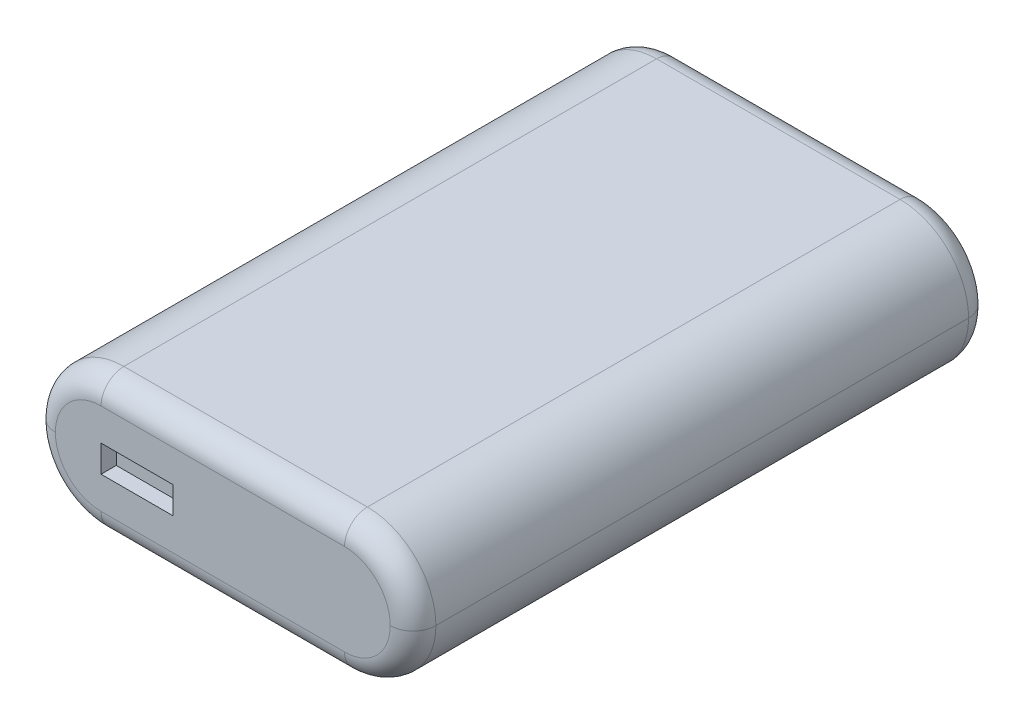
ISO-10303-21;
HEADER;
FILE_DESCRIPTION(('STEP AP214'),'2;1');
FILE_NAME('part.step','',(''),(''),'','','');
FILE_SCHEMA(('AUTOMOTIVE_DESIGN { 1 0 10303 214 1 1 1 1 }'));
ENDSEC;
DATA;
#1=APPLICATION_CONTEXT('core data for automotive mechanical design processes');
#2=APPLICATION_PROTOCOL_DEFINITION('international standard','automotive_design',2000,#1);
#3=PRODUCT_CONTEXT('',#1,'mechanical');
#4=PRODUCT('Part','Part','',(#3));
#5=PRODUCT_RELATED_PRODUCT_CATEGORY('part','',(#4));
#6=PRODUCT_DEFINITION_FORMATION('','',#4);
#7=PRODUCT_DEFINITION_CONTEXT('part definition',#1,'design');
#8=PRODUCT_DEFINITION('design','',#6,#7);
#9=PRODUCT_DEFINITION_SHAPE('','',#8);
#10=(LENGTH_UNIT() NAMED_UNIT(*) SI_UNIT(.MILLI.,.METRE.));
#11=(NAMED_UNIT(*) PLANE_ANGLE_UNIT() SI_UNIT($,.RADIAN.));
#12=(NAMED_UNIT(*) SI_UNIT($,.STERADIAN.) SOLID_ANGLE_UNIT());
#13=UNCERTAINTY_MEASURE_WITH_UNIT(LENGTH_MEASURE(1.E-05),#10,'distance_accuracy_value','');
#14=(GEOMETRIC_REPRESENTATION_CONTEXT(3) GLOBAL_UNCERTAINTY_ASSIGNED_CONTEXT((#13)) GLOBAL_UNIT_ASSIGNED_CONTEXT((#10,
#11,#12)) REPRESENTATION_CONTEXT('',''));
#15=CARTESIAN_POINT('',(0.,0.,0.));
#16=DIRECTION('',(0.,0.,1.));
#17=DIRECTION('',(1.,0.,0.));
#18=AXIS2_PLACEMENT_3D('',#15,#16,#17);
#19=CARTESIAN_POINT('',(-31.75,11.43,-48.26));
#20=DIRECTION('',(0.,0.,1.));
#21=DIRECTION('',(1.,0.,0.));
#22=AXIS2_PLACEMENT_3D('',#19,#20,#21);
#23=PLANE('',#22);
#24=DIRECTION('',(-1.,0.,0.));
#25=VECTOR('',#24,1.);
#26=CARTESIAN_POINT('',(20.32,7.62,-48.26));
#27=LINE('',#26,#25);
#28=CARTESIAN_POINT('',(-20.32,7.62,-48.26));
#29=VERTEX_POINT('',#28);
#30=CARTESIAN_POINT('',(20.32,7.62,-48.26));
#31=VERTEX_POINT('',#30);
#32=EDGE_CURVE('E244',#29,#31,#27,.F.);
#33=ORIENTED_EDGE('',*,*,#32,.T.);
#34=CARTESIAN_POINT('',(20.32,0.,-48.26));
#35=DIRECTION('',(0.,0.,1.));
#36=DIRECTION('',(1.,0.,0.));
#37=AXIS2_PLACEMENT_3D('',#34,#35,#36);
#38=CIRCLE('',#37,7.62);
#39=CARTESIAN_POINT('',(27.94,0.,-48.26));
#40=VERTEX_POINT('',#39);
#41=EDGE_CURVE('E254',#31,#40,#38,.F.);
#42=ORIENTED_EDGE('',*,*,#41,.T.);
#43=CARTESIAN_POINT('',(20.32,0.,-48.26));
#44=DIRECTION('',(0.,0.,1.));
#45=DIRECTION('',(1.,0.,0.));
#46=AXIS2_PLACEMENT_3D('',#43,#44,#45);
#47=CIRCLE('',#46,7.62);
#48=CARTESIAN_POINT('',(20.32,-7.62,-48.26));
#49=VERTEX_POINT('',#48);
#50=EDGE_CURVE('E252',#40,#49,#47,.F.);
#51=ORIENTED_EDGE('',*,*,#50,.T.);
#52=DIRECTION('',(-1.,0.,0.));
#53=VECTOR('',#52,1.);
#54=CARTESIAN_POINT('',(-31.75,-7.62,-48.26));
#55=LINE('',#54,#53);
#56=CARTESIAN_POINT('',(-20.32,-7.62,-48.26));
#57=VERTEX_POINT('',#56);
#58=EDGE_CURVE('E250',#49,#57,#55,.T.);
#59=ORIENTED_EDGE('',*,*,#58,.T.);
#60=CARTESIAN_POINT('',(-20.32,0.,-48.26));
#61=DIRECTION('',(0.,0.,1.));
#62=DIRECTION('',(1.,0.,0.));
#63=AXIS2_PLACEMENT_3D('',#60,#61,#62);
#64=CIRCLE('',#63,7.62);
#65=CARTESIAN_POINT('',(-27.94,0.,-48.26));
#66=VERTEX_POINT('',#65);
#67=EDGE_CURVE('E248',#57,#66,#64,.F.);
#68=ORIENTED_EDGE('',*,*,#67,.T.);
#69=CARTESIAN_POINT('',(-20.32,0.,-48.26));
#70=DIRECTION('',(0.,0.,1.));
#71=DIRECTION('',(1.,0.,0.));
#72=AXIS2_PLACEMENT_3D('',#69,#70,#71);
#73=CIRCLE('',#72,7.62);
#74=EDGE_CURVE('E246',#66,#29,#73,.F.);
#75=ORIENTED_EDGE('',*,*,#74,.T.);
#76=EDGE_LOOP('',(#33,#42,#51,#59,#68,#75));
#77=FACE_BOUND('',#76,.T.);
#78=ADVANCED_FACE('F36',(#77),#23,.F.);
#79=CARTESIAN_POINT('',(-31.75,11.43,48.26));
#80=DIRECTION('',(0.,0.,-1.));
#81=DIRECTION('',(-1.,0.,0.));
#82=AXIS2_PLACEMENT_3D('',#79,#80,#81);
#83=PLANE('',#82);
#84=DIRECTION('',(-1.,0.,0.));
#85=VECTOR('',#84,1.);
#86=CARTESIAN_POINT('',(-20.32,2.249999945,48.26));
#87=LINE('',#86,#85);
#88=CARTESIAN_POINT('',(-8.32,2.249999945,48.26));
#89=VERTEX_POINT('',#88);
#90=CARTESIAN_POINT('',(-20.32,2.249999945,48.26));
#91=VERTEX_POINT('',#90);
#92=EDGE_CURVE('E181',#89,#91,#87,.T.);
#93=ORIENTED_EDGE('',*,*,#92,.F.);
#94=DIRECTION('',(0.,1.,0.));
#95=VECTOR('',#94,1.);
#96=CARTESIAN_POINT('',(-8.32,2.249999945,48.26));
#97=LINE('',#96,#95);
#98=CARTESIAN_POINT('',(-8.32,-2.249999945,48.26));
#99=VERTEX_POINT('',#98);
#100=EDGE_CURVE('E53',#99,#89,#97,.T.);
#101=ORIENTED_EDGE('',*,*,#100,.F.);
#102=DIRECTION('',(1.,0.,0.));
#103=VECTOR('',#102,1.);
#104=CARTESIAN_POINT('',(-20.32,-2.249999945,48.26));
#105=LINE('',#104,#103);
#106=CARTESIAN_POINT('',(-20.32,-2.249999945,48.26));
#107=VERTEX_POINT('',#106);
#108=EDGE_CURVE('E172',#107,#99,#105,.T.);
#109=ORIENTED_EDGE('',*,*,#108,.F.);
#110=DIRECTION('',(0.,-1.,0.));
#111=VECTOR('',#110,1.);
#112=CARTESIAN_POINT('',(-20.32,2.249999945,48.26));
#113=LINE('',#112,#111);
#114=EDGE_CURVE('E175',#91,#107,#113,.T.);
#115=ORIENTED_EDGE('',*,*,#114,.F.);
#116=EDGE_LOOP('',(#93,#101,#109,#115));
#117=FACE_BOUND('',#116,.T.);
#118=DIRECTION('',(1.,0.,0.));
#119=VECTOR('',#118,1.);
#120=CARTESIAN_POINT('',(-20.32,7.62,48.26));
#121=LINE('',#120,#119);
#122=CARTESIAN_POINT('',(20.32,7.62,48.26));
#123=VERTEX_POINT('',#122);
#124=CARTESIAN_POINT('',(-20.32,7.62,48.26));
#125=VERTEX_POINT('',#124);
#126=EDGE_CURVE('E203',#123,#125,#121,.F.);
#127=ORIENTED_EDGE('',*,*,#126,.T.);
#128=CARTESIAN_POINT('',(-20.32,0.,48.26));
#129=DIRECTION('',(0.,0.,-1.));
#130=DIRECTION('',(-1.,0.,0.));
#131=AXIS2_PLACEMENT_3D('',#128,#129,#130);
#132=CIRCLE('',#131,7.62);
#133=CARTESIAN_POINT('',(-27.94,0.,48.26));
#134=VERTEX_POINT('',#133);
#135=EDGE_CURVE('E219',#125,#134,#132,.F.);
#136=ORIENTED_EDGE('',*,*,#135,.T.);
#137=CARTESIAN_POINT('',(-20.32,0.,48.26));
#138=DIRECTION('',(0.,0.,-1.));
#139=DIRECTION('',(-1.,0.,0.));
#140=AXIS2_PLACEMENT_3D('',#137,#138,#139);
#141=CIRCLE('',#140,7.62);
#142=CARTESIAN_POINT('',(-20.32,-7.62,48.26));
#143=VERTEX_POINT('',#142);
#144=EDGE_CURVE('E217',#134,#143,#141,.F.);
#145=ORIENTED_EDGE('',*,*,#144,.T.);
#146=DIRECTION('',(1.,0.,0.));
#147=VECTOR('',#146,1.);
#148=CARTESIAN_POINT('',(-31.75,-7.62,48.26));
#149=LINE('',#148,#147);
#150=CARTESIAN_POINT('',(20.32,-7.62,48.26));
#151=VERTEX_POINT('',#150);
#152=EDGE_CURVE('E215',#143,#151,#149,.T.);
#153=ORIENTED_EDGE('',*,*,#152,.T.);
#154=CARTESIAN_POINT('',(20.32,0.,48.26));
#155=DIRECTION('',(0.,0.,-1.));
#156=DIRECTION('',(-1.,0.,0.));
#157=AXIS2_PLACEMENT_3D('',#154,#155,#156);
#158=CIRCLE('',#157,7.62);
#159=CARTESIAN_POINT('',(27.94,0.,48.26));
#160=VERTEX_POINT('',#159);
#161=EDGE_CURVE('E213',#151,#160,#158,.F.);
#162=ORIENTED_EDGE('',*,*,#161,.T.);
#163=CARTESIAN_POINT('',(20.32,0.,48.26));
#164=DIRECTION('',(0.,0.,-1.));
#165=DIRECTION('',(-1.,0.,0.));
#166=AXIS2_PLACEMENT_3D('',#163,#164,#165);
#167=CIRCLE('',#166,7.62);
#168=EDGE_CURVE('E211',#160,#123,#167,.F.);
#169=ORIENTED_EDGE('',*,*,#168,.T.);
#170=EDGE_LOOP('',(#127,#136,#145,#153,#162,#169));
#171=FACE_BOUND('',#170,.T.);
#172=ADVANCED_FACE('F366',(#117,#171),#83,.F.);
#173=CARTESIAN_POINT('',(0.,11.43,0.));
#174=DIRECTION('',(0.,1.,0.));
#175=DIRECTION('',(0.,0.,1.));
#176=AXIS2_PLACEMENT_3D('',#173,#174,#175);
#177=PLANE('',#176);
#178=DIRECTION('',(0.,0.,1.));
#179=VECTOR('',#178,1.);
#180=CARTESIAN_POINT('',(-20.32,11.43,48.26));
#181=LINE('',#180,#179);
#182=CARTESIAN_POINT('',(-20.32,11.43,-44.45));
#183=VERTEX_POINT('',#182);
#184=CARTESIAN_POINT('',(-20.32,11.43,44.45));
#185=VERTEX_POINT('',#184);
#186=EDGE_CURVE('E200',#183,#185,#181,.T.);
#187=ORIENTED_EDGE('',*,*,#186,.T.);
#188=DIRECTION('',(1.,0.,0.));
#189=VECTOR('',#188,1.);
#190=CARTESIAN_POINT('',(20.32,11.43,44.45));
#191=LINE('',#190,#189);
#192=CARTESIAN_POINT('',(20.32,11.43,44.45));
#193=VERTEX_POINT('',#192);
#194=EDGE_CURVE('E11',#185,#193,#191,.T.);
#195=ORIENTED_EDGE('',*,*,#194,.T.);
#196=DIRECTION('',(0.,0.,-1.));
#197=VECTOR('',#196,1.);
#198=CARTESIAN_POINT('',(20.32,11.43,-48.26));
#199=LINE('',#198,#197);
#200=CARTESIAN_POINT('',(20.32,11.43,-44.45));
#201=VERTEX_POINT('',#200);
#202=EDGE_CURVE('E197',#193,#201,#199,.T.);
#203=ORIENTED_EDGE('',*,*,#202,.T.);
#204=DIRECTION('',(-1.,0.,0.));
#205=VECTOR('',#204,1.);
#206=CARTESIAN_POINT('',(-20.32,11.43,-44.45));
#207=LINE('',#206,#205);
#208=EDGE_CURVE('E45',#201,#183,#207,.T.);
#209=ORIENTED_EDGE('',*,*,#208,.T.);
#210=EDGE_LOOP('',(#187,#195,#203,#209));
#211=FACE_BOUND('',#210,.T.);
#212=ADVANCED_FACE('F330',(#211),#177,.T.);
#213=CARTESIAN_POINT('',(0.,-11.43,0.));
#214=DIRECTION('',(0.,1.,0.));
#215=DIRECTION('',(0.,0.,1.));
#216=AXIS2_PLACEMENT_3D('',#213,#214,#215);
#217=PLANE('',#216);
#218=DIRECTION('',(0.,0.,-1.));
#219=VECTOR('',#218,1.);
#220=CARTESIAN_POINT('',(20.32,-11.43,0.));
#221=LINE('',#220,#219);
#222=CARTESIAN_POINT('',(20.32,-11.43,-44.45));
#223=VERTEX_POINT('',#222);
#224=CARTESIAN_POINT('',(20.32,-11.43,44.45));
#225=VERTEX_POINT('',#224);
#226=EDGE_CURVE('E190',#223,#225,#221,.F.);
#227=ORIENTED_EDGE('',*,*,#226,.T.);
#228=DIRECTION('',(1.,0.,0.));
#229=VECTOR('',#228,1.);
#230=CARTESIAN_POINT('',(0.,-11.43,44.45));
#231=LINE('',#230,#229);
#232=CARTESIAN_POINT('',(-20.32,-11.43,44.45));
#233=VERTEX_POINT('',#232);
#234=EDGE_CURVE('E233',#225,#233,#231,.F.);
#235=ORIENTED_EDGE('',*,*,#234,.T.);
#236=DIRECTION('',(0.,0.,1.));
#237=VECTOR('',#236,1.);
#238=CARTESIAN_POINT('',(-20.32,-11.43,0.));
#239=LINE('',#238,#237);
#240=CARTESIAN_POINT('',(-20.32,-11.43,-44.45));
#241=VERTEX_POINT('',#240);
#242=EDGE_CURVE('E193',#233,#241,#239,.F.);
#243=ORIENTED_EDGE('',*,*,#242,.T.);
#244=DIRECTION('',(-1.,0.,0.));
#245=VECTOR('',#244,1.);
#246=CARTESIAN_POINT('',(0.,-11.43,-44.45));
#247=LINE('',#246,#245);
#248=EDGE_CURVE('E231',#241,#223,#247,.F.);
#249=ORIENTED_EDGE('',*,*,#248,.T.);
#250=EDGE_LOOP('',(#227,#235,#243,#249));
#251=FACE_BOUND('',#250,.T.);
#252=ADVANCED_FACE('F303',(#251),#217,.F.);
#253=CARTESIAN_POINT('',(-20.32,0.,0.));
#254=DIRECTION('',(0.,0.,-1.));
#255=DIRECTION('',(-1.,0.,0.));
#256=AXIS2_PLACEMENT_3D('',#253,#254,#255);
#257=CYLINDRICAL_SURFACE('',#256,11.43);
#258=DIRECTION('',(0.,0.,1.));
#259=VECTOR('',#258,1.);
#260=CARTESIAN_POINT('',(-31.75,0.,-48.26));
#261=LINE('',#260,#259);
#262=CARTESIAN_POINT('',(-31.75,0.,44.45));
#263=VERTEX_POINT('',#262);
#264=CARTESIAN_POINT('',(-31.75,0.,-44.45));
#265=VERTEX_POINT('',#264);
#266=EDGE_CURVE('E194',#263,#265,#261,.F.);
#267=ORIENTED_EDGE('',*,*,#266,.F.);
#268=CARTESIAN_POINT('',(-20.32,0.,44.45));
#269=DIRECTION('',(0.,0.,-1.));
#270=DIRECTION('',(-1.,0.,0.));
#271=AXIS2_PLACEMENT_3D('',#268,#269,#270);
#272=CIRCLE('',#271,11.43);
#273=EDGE_CURVE('E224',#263,#185,#272,.T.);
#274=ORIENTED_EDGE('',*,*,#273,.T.);
#275=ORIENTED_EDGE('',*,*,#186,.F.);
#276=CARTESIAN_POINT('',(-20.32,0.,-44.45));
#277=DIRECTION('',(0.,0.,1.));
#278=DIRECTION('',(1.,0.,0.));
#279=AXIS2_PLACEMENT_3D('',#276,#277,#278);
#280=CIRCLE('',#279,11.43);
#281=EDGE_CURVE('E222',#183,#265,#280,.T.);
#282=ORIENTED_EDGE('',*,*,#281,.T.);
#283=EDGE_LOOP('',(#267,#274,#275,#282));
#284=FACE_BOUND('',#283,.T.);
#285=ADVANCED_FACE('F317',(#284),#257,.T.);
#286=CARTESIAN_POINT('',(-20.32,0.,-48.26));
#287=DIRECTION('',(0.,0.,1.));
#288=DIRECTION('',(1.,0.,0.));
#289=AXIS2_PLACEMENT_3D('',#286,#287,#288);
#290=CYLINDRICAL_SURFACE('',#289,11.43);
#291=ORIENTED_EDGE('',*,*,#242,.F.);
#292=CARTESIAN_POINT('',(-20.32,0.,44.45));
#293=DIRECTION('',(0.,0.,-1.));
#294=DIRECTION('',(-1.,0.,0.));
#295=AXIS2_PLACEMENT_3D('',#292,#293,#294);
#296=CIRCLE('',#295,11.43);
#297=EDGE_CURVE('E229',#233,#263,#296,.T.);
#298=ORIENTED_EDGE('',*,*,#297,.T.);
#299=ORIENTED_EDGE('',*,*,#266,.T.);
#300=CARTESIAN_POINT('',(-20.32,0.,-44.45));
#301=DIRECTION('',(0.,0.,1.));
#302=DIRECTION('',(1.,0.,0.));
#303=AXIS2_PLACEMENT_3D('',#300,#301,#302);
#304=CIRCLE('',#303,11.43);
#305=EDGE_CURVE('E227',#265,#241,#304,.T.);
#306=ORIENTED_EDGE('',*,*,#305,.T.);
#307=EDGE_LOOP('',(#291,#298,#299,#306));
#308=FACE_BOUND('',#307,.T.);
#309=ADVANCED_FACE('F299',(#308),#290,.T.);
#310=CARTESIAN_POINT('',(20.32,0.,0.));
#311=DIRECTION('',(0.,0.,1.));
#312=DIRECTION('',(1.,0.,0.));
#313=AXIS2_PLACEMENT_3D('',#310,#311,#312);
#314=CYLINDRICAL_SURFACE('',#313,11.43);
#315=ORIENTED_EDGE('',*,*,#202,.F.);
#316=CARTESIAN_POINT('',(20.32,0.,44.45));
#317=DIRECTION('',(0.,0.,-1.));
#318=DIRECTION('',(-1.,0.,0.));
#319=AXIS2_PLACEMENT_3D('',#316,#317,#318);
#320=CIRCLE('',#319,11.43);
#321=CARTESIAN_POINT('',(31.75,0.,44.45));
#322=VERTEX_POINT('',#321);
#323=EDGE_CURVE('E242',#193,#322,#320,.T.);
#324=ORIENTED_EDGE('',*,*,#323,.T.);
#325=DIRECTION('',(0.,0.,-1.));
#326=VECTOR('',#325,1.);
#327=CARTESIAN_POINT('',(31.75,0.,48.26));
#328=LINE('',#327,#326);
#329=CARTESIAN_POINT('',(31.75,0.,-44.45));
#330=VERTEX_POINT('',#329);
#331=EDGE_CURVE('E206',#330,#322,#328,.F.);
#332=ORIENTED_EDGE('',*,*,#331,.F.);
#333=CARTESIAN_POINT('',(20.32,0.,-44.45));
#334=DIRECTION('',(0.,0.,1.));
#335=DIRECTION('',(1.,0.,0.));
#336=AXIS2_PLACEMENT_3D('',#333,#334,#335);
#337=CIRCLE('',#336,11.43);
#338=EDGE_CURVE('E239',#330,#201,#337,.T.);
#339=ORIENTED_EDGE('',*,*,#338,.T.);
#340=EDGE_LOOP('',(#315,#324,#332,#339));
#341=FACE_BOUND('',#340,.T.);
#342=ADVANCED_FACE('F333',(#341),#314,.T.);
#343=CARTESIAN_POINT('',(20.32,0.,-48.26));
#344=DIRECTION('',(0.,0.,-1.));
#345=DIRECTION('',(-1.,0.,0.));
#346=AXIS2_PLACEMENT_3D('',#343,#344,#345);
#347=CYLINDRICAL_SURFACE('',#346,11.43);
#348=ORIENTED_EDGE('',*,*,#331,.T.);
#349=CARTESIAN_POINT('',(20.32,0.,44.45));
#350=DIRECTION('',(0.,0.,-1.));
#351=DIRECTION('',(-1.,0.,0.));
#352=AXIS2_PLACEMENT_3D('',#349,#350,#351);
#353=CIRCLE('',#352,11.43);
#354=EDGE_CURVE('E237',#322,#225,#353,.T.);
#355=ORIENTED_EDGE('',*,*,#354,.T.);
#356=ORIENTED_EDGE('',*,*,#226,.F.);
#357=CARTESIAN_POINT('',(20.32,0.,-44.45));
#358=DIRECTION('',(0.,0.,1.));
#359=DIRECTION('',(1.,0.,0.));
#360=AXIS2_PLACEMENT_3D('',#357,#358,#359);
#361=CIRCLE('',#360,11.43);
#362=EDGE_CURVE('E235',#223,#330,#361,.T.);
#363=ORIENTED_EDGE('',*,*,#362,.T.);
#364=EDGE_LOOP('',(#348,#355,#356,#363));
#365=FACE_BOUND('',#364,.T.);
#366=ADVANCED_FACE('F344',(#365),#347,.T.);
#367=CARTESIAN_POINT('',(20.32,0.,44.45));
#368=DIRECTION('',(0.,0.,-1.));
#369=DIRECTION('',(-1.,0.,0.));
#370=AXIS2_PLACEMENT_3D('',#367,#368,#369);
#371=TOROIDAL_SURFACE('',#370,7.62,3.81);
#372=CARTESIAN_POINT('',(20.32,-7.62,44.45));
#373=DIRECTION('',(-1.,0.,0.));
#374=DIRECTION('',(0.,0.,1.));
#375=AXIS2_PLACEMENT_3D('',#372,#373,#374);
#376=CIRCLE('',#375,3.81);
#377=EDGE_CURVE('E268',#225,#151,#376,.T.);
#378=ORIENTED_EDGE('',*,*,#377,.F.);
#379=ORIENTED_EDGE('',*,*,#354,.F.);
#380=CARTESIAN_POINT('',(27.94,0.,44.45));
#381=DIRECTION('',(0.,1.,0.));
#382=DIRECTION('',(0.,0.,1.));
#383=AXIS2_PLACEMENT_3D('',#380,#381,#382);
#384=CIRCLE('',#383,3.81);
#385=EDGE_CURVE('E209',#160,#322,#384,.T.);
#386=ORIENTED_EDGE('',*,*,#385,.F.);
#387=ORIENTED_EDGE('',*,*,#161,.F.);
#388=EDGE_LOOP('',(#378,#379,#386,#387));
#389=FACE_BOUND('',#388,.T.);
#390=ADVANCED_FACE('F342',(#389),#371,.T.);
#391=CARTESIAN_POINT('',(20.32,0.,44.45));
#392=DIRECTION('',(0.,0.,-1.));
#393=DIRECTION('',(-1.,0.,0.));
#394=AXIS2_PLACEMENT_3D('',#391,#392,#393);
#395=TOROIDAL_SURFACE('',#394,7.62,3.81);
#396=ORIENTED_EDGE('',*,*,#385,.T.);
#397=ORIENTED_EDGE('',*,*,#323,.F.);
#398=CARTESIAN_POINT('',(20.32,7.62,44.45));
#399=DIRECTION('',(-1.,0.,0.));
#400=DIRECTION('',(0.,0.,1.));
#401=AXIS2_PLACEMENT_3D('',#398,#399,#400);
#402=CIRCLE('',#401,3.81);
#403=EDGE_CURVE('E265',#123,#193,#402,.T.);
#404=ORIENTED_EDGE('',*,*,#403,.F.);
#405=ORIENTED_EDGE('',*,*,#168,.F.);
#406=EDGE_LOOP('',(#396,#397,#404,#405));
#407=FACE_BOUND('',#406,.T.);
#408=ADVANCED_FACE('F336',(#407),#395,.T.);
#409=CARTESIAN_POINT('',(-31.75,-7.62,44.45));
#410=DIRECTION('',(1.,0.,0.));
#411=DIRECTION('',(0.,0.,-1.));
#412=AXIS2_PLACEMENT_3D('',#409,#410,#411);
#413=CYLINDRICAL_SURFACE('',#412,3.81);
#414=ORIENTED_EDGE('',*,*,#377,.T.);
#415=ORIENTED_EDGE('',*,*,#152,.F.);
#416=CARTESIAN_POINT('',(-20.32,-7.62,44.45));
#417=DIRECTION('',(-1.,0.,0.));
#418=DIRECTION('',(0.,0.,1.));
#419=AXIS2_PLACEMENT_3D('',#416,#417,#418);
#420=CIRCLE('',#419,3.81);
#421=EDGE_CURVE('E262',#233,#143,#420,.T.);
#422=ORIENTED_EDGE('',*,*,#421,.F.);
#423=ORIENTED_EDGE('',*,*,#234,.F.);
#424=EDGE_LOOP('',(#414,#415,#422,#423));
#425=FACE_BOUND('',#424,.T.);
#426=ADVANCED_FACE('F308',(#425),#413,.T.);
#427=CARTESIAN_POINT('',(0.,7.62,44.45));
#428=DIRECTION('',(-1.,0.,0.));
#429=DIRECTION('',(0.,0.,1.));
#430=AXIS2_PLACEMENT_3D('',#427,#428,#429);
#431=CYLINDRICAL_SURFACE('',#430,3.81);
#432=ORIENTED_EDGE('',*,*,#403,.T.);
#433=ORIENTED_EDGE('',*,*,#194,.F.);
#434=CARTESIAN_POINT('',(-20.32,7.62,44.45));
#435=DIRECTION('',(-1.,0.,0.));
#436=DIRECTION('',(0.,0.,1.));
#437=AXIS2_PLACEMENT_3D('',#434,#435,#436);
#438=CIRCLE('',#437,3.81);
#439=EDGE_CURVE('E260',#125,#185,#438,.T.);
#440=ORIENTED_EDGE('',*,*,#439,.F.);
#441=ORIENTED_EDGE('',*,*,#126,.F.);
#442=EDGE_LOOP('',(#432,#433,#440,#441));
#443=FACE_BOUND('',#442,.T.);
#444=ADVANCED_FACE('F326',(#443),#431,.T.);
#445=CARTESIAN_POINT('',(-20.32,0.,44.45));
#446=DIRECTION('',(0.,0.,-1.));
#447=DIRECTION('',(-1.,0.,0.));
#448=AXIS2_PLACEMENT_3D('',#445,#446,#447);
#449=TOROIDAL_SURFACE('',#448,7.62,3.81);
#450=ORIENTED_EDGE('',*,*,#421,.T.);
#451=ORIENTED_EDGE('',*,*,#144,.F.);
#452=CARTESIAN_POINT('',(-27.94,0.,44.45));
#453=DIRECTION('',(0.,1.,0.));
#454=DIRECTION('',(0.,0.,1.));
#455=AXIS2_PLACEMENT_3D('',#452,#453,#454);
#456=CIRCLE('',#455,3.81);
#457=EDGE_CURVE('E258',#263,#134,#456,.T.);
#458=ORIENTED_EDGE('',*,*,#457,.F.);
#459=ORIENTED_EDGE('',*,*,#297,.F.);
#460=EDGE_LOOP('',(#450,#451,#458,#459));
#461=FACE_BOUND('',#460,.T.);
#462=ADVANCED_FACE('F314',(#461),#449,.T.);
#463=CARTESIAN_POINT('',(-20.32,0.,44.45));
#464=DIRECTION('',(0.,0.,-1.));
#465=DIRECTION('',(-1.,0.,0.));
#466=AXIS2_PLACEMENT_3D('',#463,#464,#465);
#467=TOROIDAL_SURFACE('',#466,7.62,3.81);
#468=ORIENTED_EDGE('',*,*,#439,.T.);
#469=ORIENTED_EDGE('',*,*,#273,.F.);
#470=ORIENTED_EDGE('',*,*,#457,.T.);
#471=ORIENTED_EDGE('',*,*,#135,.F.);
#472=EDGE_LOOP('',(#468,#469,#470,#471));
#473=FACE_BOUND('',#472,.T.);
#474=ADVANCED_FACE('F320',(#473),#467,.T.);
#475=CARTESIAN_POINT('',(-20.32,0.,-44.45));
#476=DIRECTION('',(0.,0.,1.));
#477=DIRECTION('',(1.,0.,0.));
#478=AXIS2_PLACEMENT_3D('',#475,#476,#477);
#479=TOROIDAL_SURFACE('',#478,7.62,3.81);
#480=CARTESIAN_POINT('',(-20.32,-7.62,-44.45));
#481=DIRECTION('',(1.,0.,0.));
#482=DIRECTION('',(0.,0.,-1.));
#483=AXIS2_PLACEMENT_3D('',#480,#481,#482);
#484=CIRCLE('',#483,3.81);
#485=EDGE_CURVE('E281',#241,#57,#484,.T.);
#486=ORIENTED_EDGE('',*,*,#485,.F.);
#487=ORIENTED_EDGE('',*,*,#305,.F.);
#488=CARTESIAN_POINT('',(-27.94,0.,-44.45));
#489=DIRECTION('',(0.,1.,0.));
#490=DIRECTION('',(0.,0.,1.));
#491=AXIS2_PLACEMENT_3D('',#488,#489,#490);
#492=CIRCLE('',#491,3.81);
#493=EDGE_CURVE('E40',#66,#265,#492,.T.);
#494=ORIENTED_EDGE('',*,*,#493,.F.);
#495=ORIENTED_EDGE('',*,*,#67,.F.);
#496=EDGE_LOOP('',(#486,#487,#494,#495));
#497=FACE_BOUND('',#496,.T.);
#498=ADVANCED_FACE('F38',(#497),#479,.T.);
#499=CARTESIAN_POINT('',(-20.32,0.,-44.45));
#500=DIRECTION('',(0.,0.,1.));
#501=DIRECTION('',(1.,0.,0.));
#502=AXIS2_PLACEMENT_3D('',#499,#500,#501);
#503=TOROIDAL_SURFACE('',#502,7.62,3.81);
#504=ORIENTED_EDGE('',*,*,#493,.T.);
#505=ORIENTED_EDGE('',*,*,#281,.F.);
#506=CARTESIAN_POINT('',(-20.32,7.62,-44.45));
#507=DIRECTION('',(1.,0.,0.));
#508=DIRECTION('',(0.,0.,-1.));
#509=AXIS2_PLACEMENT_3D('',#506,#507,#508);
#510=CIRCLE('',#509,3.81);
#511=EDGE_CURVE('E279',#29,#183,#510,.T.);
#512=ORIENTED_EDGE('',*,*,#511,.F.);
#513=ORIENTED_EDGE('',*,*,#74,.F.);
#514=EDGE_LOOP('',(#504,#505,#512,#513));
#515=FACE_BOUND('',#514,.T.);
#516=ADVANCED_FACE('F292',(#515),#503,.T.);
#517=CARTESIAN_POINT('',(-31.75,-7.62,-44.45));
#518=DIRECTION('',(-1.,0.,0.));
#519=DIRECTION('',(0.,0.,1.));
#520=AXIS2_PLACEMENT_3D('',#517,#518,#519);
#521=CYLINDRICAL_SURFACE('',#520,3.81);
#522=ORIENTED_EDGE('',*,*,#485,.T.);
#523=ORIENTED_EDGE('',*,*,#58,.F.);
#524=CARTESIAN_POINT('',(20.32,-7.62,-44.45));
#525=DIRECTION('',(1.,0.,0.));
#526=DIRECTION('',(0.,0.,-1.));
#527=AXIS2_PLACEMENT_3D('',#524,#525,#526);
#528=CIRCLE('',#527,3.81);
#529=EDGE_CURVE('E276',#223,#49,#528,.T.);
#530=ORIENTED_EDGE('',*,*,#529,.F.);
#531=ORIENTED_EDGE('',*,*,#248,.F.);
#532=EDGE_LOOP('',(#522,#523,#530,#531));
#533=FACE_BOUND('',#532,.T.);
#534=ADVANCED_FACE('F357',(#533),#521,.T.);
#535=CARTESIAN_POINT('',(0.,7.62,-44.45));
#536=DIRECTION('',(1.,0.,0.));
#537=DIRECTION('',(0.,0.,-1.));
#538=AXIS2_PLACEMENT_3D('',#535,#536,#537);
#539=CYLINDRICAL_SURFACE('',#538,3.81);
#540=ORIENTED_EDGE('',*,*,#511,.T.);
#541=ORIENTED_EDGE('',*,*,#208,.F.);
#542=CARTESIAN_POINT('',(20.32,7.62,-44.45));
#543=DIRECTION('',(1.,0.,0.));
#544=DIRECTION('',(0.,0.,-1.));
#545=AXIS2_PLACEMENT_3D('',#542,#543,#544);
#546=CIRCLE('',#545,3.81);
#547=EDGE_CURVE('E274',#31,#201,#546,.T.);
#548=ORIENTED_EDGE('',*,*,#547,.F.);
#549=ORIENTED_EDGE('',*,*,#32,.F.);
#550=EDGE_LOOP('',(#540,#541,#548,#549));
#551=FACE_BOUND('',#550,.T.);
#552=ADVANCED_FACE('F355',(#551),#539,.T.);
#553=CARTESIAN_POINT('',(20.32,0.,-44.45));
#554=DIRECTION('',(0.,0.,1.));
#555=DIRECTION('',(1.,0.,0.));
#556=AXIS2_PLACEMENT_3D('',#553,#554,#555);
#557=TOROIDAL_SURFACE('',#556,7.62,3.81);
#558=ORIENTED_EDGE('',*,*,#529,.T.);
#559=ORIENTED_EDGE('',*,*,#50,.F.);
#560=CARTESIAN_POINT('',(27.94,0.,-44.45));
#561=DIRECTION('',(0.,1.,0.));
#562=DIRECTION('',(0.,0.,1.));
#563=AXIS2_PLACEMENT_3D('',#560,#561,#562);
#564=CIRCLE('',#563,3.81);
#565=EDGE_CURVE('E61',#330,#40,#564,.T.);
#566=ORIENTED_EDGE('',*,*,#565,.F.);
#567=ORIENTED_EDGE('',*,*,#362,.F.);
#568=EDGE_LOOP('',(#558,#559,#566,#567));
#569=FACE_BOUND('',#568,.T.);
#570=ADVANCED_FACE('F351',(#569),#557,.T.);
#571=CARTESIAN_POINT('',(20.32,0.,-44.45));
#572=DIRECTION('',(0.,0.,1.));
#573=DIRECTION('',(1.,0.,0.));
#574=AXIS2_PLACEMENT_3D('',#571,#572,#573);
#575=TOROIDAL_SURFACE('',#574,7.62,3.81);
#576=ORIENTED_EDGE('',*,*,#547,.T.);
#577=ORIENTED_EDGE('',*,*,#338,.F.);
#578=ORIENTED_EDGE('',*,*,#565,.T.);
#579=ORIENTED_EDGE('',*,*,#41,.F.);
#580=EDGE_LOOP('',(#576,#577,#578,#579));
#581=FACE_BOUND('',#580,.T.);
#582=ADVANCED_FACE('F347',(#581),#575,.T.);
#583=CARTESIAN_POINT('',(-8.32,2.249999945,45.72));
#584=DIRECTION('',(1.,0.,0.));
#585=DIRECTION('',(0.,0.,-1.));
#586=AXIS2_PLACEMENT_3D('',#583,#584,#585);
#587=PLANE('',#586);
#588=ORIENTED_EDGE('',*,*,#100,.T.);
#589=DIRECTION('',(0.,0.,1.));
#590=VECTOR('',#589,1.);
#591=CARTESIAN_POINT('',(-8.32,2.249999945,45.72));
#592=LINE('',#591,#590);
#593=CARTESIAN_POINT('',(-8.32,2.249999945,45.72));
#594=VERTEX_POINT('',#593);
#595=EDGE_CURVE('E150',#594,#89,#592,.T.);
#596=ORIENTED_EDGE('',*,*,#595,.F.);
#597=DIRECTION('',(0.,1.,0.));
#598=VECTOR('',#597,1.);
#599=CARTESIAN_POINT('',(-8.32,2.249999945,45.72));
#600=LINE('',#599,#598);
#601=CARTESIAN_POINT('',(-8.32,-2.249999945,45.72));
#602=VERTEX_POINT('',#601);
#603=EDGE_CURVE('E154',#602,#594,#600,.T.);
#604=ORIENTED_EDGE('',*,*,#603,.F.);
#605=DIRECTION('',(0.,0.,1.));
#606=VECTOR('',#605,1.);
#607=CARTESIAN_POINT('',(-8.32,-2.249999945,45.72));
#608=LINE('',#607,#606);
#609=EDGE_CURVE('E185',#602,#99,#608,.T.);
#610=ORIENTED_EDGE('',*,*,#609,.T.);
#611=EDGE_LOOP('',(#588,#596,#604,#610));
#612=FACE_BOUND('',#611,.T.);
#613=ADVANCED_FACE('F152',(#612),#587,.F.);
#614=CARTESIAN_POINT('',(-20.32,-2.249999945,45.72));
#615=DIRECTION('',(0.,-1.,0.));
#616=DIRECTION('',(0.,0.,-1.));
#617=AXIS2_PLACEMENT_3D('',#614,#615,#616);
#618=PLANE('',#617);
#619=ORIENTED_EDGE('',*,*,#108,.T.);
#620=ORIENTED_EDGE('',*,*,#609,.F.);
#621=DIRECTION('',(1.,0.,0.));
#622=VECTOR('',#621,1.);
#623=CARTESIAN_POINT('',(-20.32,-2.249999945,45.72));
#624=LINE('',#623,#622);
#625=CARTESIAN_POINT('',(-20.32,-2.249999945,45.72));
#626=VERTEX_POINT('',#625);
#627=EDGE_CURVE('E160',#626,#602,#624,.T.);
#628=ORIENTED_EDGE('',*,*,#627,.F.);
#629=DIRECTION('',(0.,0.,1.));
#630=VECTOR('',#629,1.);
#631=CARTESIAN_POINT('',(-20.32,-2.249999945,45.72));
#632=LINE('',#631,#630);
#633=EDGE_CURVE('E187',#626,#107,#632,.T.);
#634=ORIENTED_EDGE('',*,*,#633,.T.);
#635=EDGE_LOOP('',(#619,#620,#628,#634));
#636=FACE_BOUND('',#635,.T.);
#637=ADVANCED_FACE('F399',(#636),#618,.F.);
#638=CARTESIAN_POINT('',(-20.32,2.249999945,45.72));
#639=DIRECTION('',(-1.,0.,0.));
#640=DIRECTION('',(0.,0.,1.));
#641=AXIS2_PLACEMENT_3D('',#638,#639,#640);
#642=PLANE('',#641);
#643=ORIENTED_EDGE('',*,*,#114,.T.);
#644=ORIENTED_EDGE('',*,*,#633,.F.);
#645=DIRECTION('',(0.,-1.,0.));
#646=VECTOR('',#645,1.);
#647=CARTESIAN_POINT('',(-20.32,2.249999945,45.72));
#648=LINE('',#647,#646);
#649=CARTESIAN_POINT('',(-20.32,2.249999945,45.72));
#650=VERTEX_POINT('',#649);
#651=EDGE_CURVE('E168',#650,#626,#648,.T.);
#652=ORIENTED_EDGE('',*,*,#651,.F.);
#653=DIRECTION('',(0.,0.,1.));
#654=VECTOR('',#653,1.);
#655=CARTESIAN_POINT('',(-20.32,2.249999945,45.72));
#656=LINE('',#655,#654);
#657=EDGE_CURVE('E159',#650,#91,#656,.T.);
#658=ORIENTED_EDGE('',*,*,#657,.T.);
#659=EDGE_LOOP('',(#643,#644,#652,#658));
#660=FACE_BOUND('',#659,.T.);
#661=ADVANCED_FACE('F404',(#660),#642,.F.);
#662=CARTESIAN_POINT('',(-20.32,2.249999945,45.72));
#663=DIRECTION('',(0.,1.,0.));
#664=DIRECTION('',(0.,0.,1.));
#665=AXIS2_PLACEMENT_3D('',#662,#663,#664);
#666=PLANE('',#665);
#667=ORIENTED_EDGE('',*,*,#92,.T.);
#668=ORIENTED_EDGE('',*,*,#657,.F.);
#669=DIRECTION('',(-1.,0.,0.));
#670=VECTOR('',#669,1.);
#671=CARTESIAN_POINT('',(-20.32,2.249999945,45.72));
#672=LINE('',#671,#670);
#673=EDGE_CURVE('E163',#594,#650,#672,.T.);
#674=ORIENTED_EDGE('',*,*,#673,.F.);
#675=ORIENTED_EDGE('',*,*,#595,.T.);
#676=EDGE_LOOP('',(#667,#668,#674,#675));
#677=FACE_BOUND('',#676,.T.);
#678=ADVANCED_FACE('F164',(#677),#666,.F.);
#679=CARTESIAN_POINT('',(0.,0.,45.72));
#680=DIRECTION('',(0.,0.,1.));
#681=DIRECTION('',(1.,0.,0.));
#682=AXIS2_PLACEMENT_3D('',#679,#680,#681);
#683=PLANE('',#682);
#684=ORIENTED_EDGE('',*,*,#603,.T.);
#685=ORIENTED_EDGE('',*,*,#673,.T.);
#686=ORIENTED_EDGE('',*,*,#651,.T.);
#687=ORIENTED_EDGE('',*,*,#627,.T.);
#688=EDGE_LOOP('',(#684,#685,#686,#687));
#689=FACE_BOUND('',#688,.T.);
#690=ADVANCED_FACE('F170',(#689),#683,.T.);
#691=CLOSED_SHELL('',(#78,#172,#212,#252,#285,#309,#342,#366,#390,#408,#426,#444,#462,#474,#498,
#516,#534,#552,#570,#582,#613,#637,#661,#678,#690));
#692=MANIFOLD_SOLID_BREP('B2',#691);
#693=ADVANCED_BREP_SHAPE_REPRESENTATION('',(#18,#692),#14);
#694=SHAPE_DEFINITION_REPRESENTATION(#9,#693);
ENDSEC;
END-ISO-10303-21;
